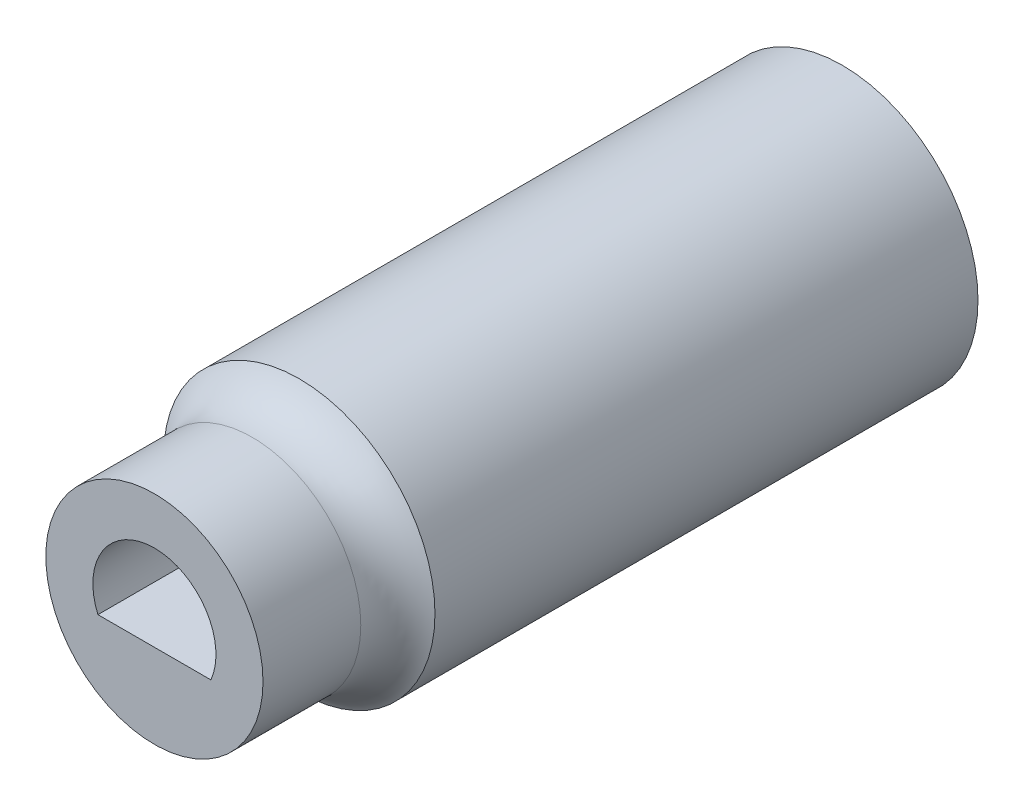
ISO-10303-21;
HEADER;
FILE_DESCRIPTION(('STEP AP214'),'2;1');
FILE_NAME('part.step','',(''),(''),'','','');
FILE_SCHEMA(('AUTOMOTIVE_DESIGN { 1 0 10303 214 1 1 1 1 }'));
ENDSEC;
DATA;
#1=APPLICATION_CONTEXT('core data for automotive mechanical design processes');
#2=APPLICATION_PROTOCOL_DEFINITION('international standard','automotive_design',2000,#1);
#3=PRODUCT_CONTEXT('',#1,'mechanical');
#4=PRODUCT('Part','Part','',(#3));
#5=PRODUCT_RELATED_PRODUCT_CATEGORY('part','',(#4));
#6=PRODUCT_DEFINITION_FORMATION('','',#4);
#7=PRODUCT_DEFINITION_CONTEXT('part definition',#1,'design');
#8=PRODUCT_DEFINITION('design','',#6,#7);
#9=PRODUCT_DEFINITION_SHAPE('','',#8);
#10=(LENGTH_UNIT() NAMED_UNIT(*) SI_UNIT(.MILLI.,.METRE.));
#11=(NAMED_UNIT(*) PLANE_ANGLE_UNIT() SI_UNIT($,.RADIAN.));
#12=(NAMED_UNIT(*) SI_UNIT($,.STERADIAN.) SOLID_ANGLE_UNIT());
#13=UNCERTAINTY_MEASURE_WITH_UNIT(LENGTH_MEASURE(1.E-05),#10,'distance_accuracy_value','');
#14=(GEOMETRIC_REPRESENTATION_CONTEXT(3) GLOBAL_UNCERTAINTY_ASSIGNED_CONTEXT((#13)) GLOBAL_UNIT_ASSIGNED_CONTEXT((#10,
#11,#12)) REPRESENTATION_CONTEXT('',''));
#15=CARTESIAN_POINT('',(0.,0.,0.));
#16=DIRECTION('',(0.,0.,1.));
#17=DIRECTION('',(1.,0.,0.));
#18=AXIS2_PLACEMENT_3D('',#15,#16,#17);
#19=CARTESIAN_POINT('',(0.,0.,38.));
#20=DIRECTION('',(0.,0.,-1.));
#21=DIRECTION('',(-1.,0.,0.));
#22=AXIS2_PLACEMENT_3D('',#19,#20,#21);
#23=CYLINDRICAL_SURFACE('',#22,7.5);
#24=CARTESIAN_POINT('',(0.,0.,0.));
#25=DIRECTION('',(0.,0.,1.));
#26=DIRECTION('',(1.,0.,0.));
#27=AXIS2_PLACEMENT_3D('',#24,#25,#26);
#28=CIRCLE('',#27,7.5);
#29=CARTESIAN_POINT('',(7.5,0.,0.));
#30=VERTEX_POINT('',#29);
#31=EDGE_CURVE('E42',#30,#30,#28,.T.);
#32=ORIENTED_EDGE('',*,*,#31,.T.);
#33=EDGE_LOOP('',(#32));
#34=FACE_BOUND('',#33,.T.);
#35=CARTESIAN_POINT('',(0.,0.,30.));
#36=DIRECTION('',(0.,0.,1.));
#37=DIRECTION('',(1.,0.,0.));
#38=AXIS2_PLACEMENT_3D('',#35,#36,#37);
#39=CIRCLE('',#38,7.5);
#40=CARTESIAN_POINT('',(7.5,0.,30.));
#41=VERTEX_POINT('',#40);
#42=EDGE_CURVE('E88',#41,#41,#39,.T.);
#43=ORIENTED_EDGE('',*,*,#42,.F.);
#44=EDGE_LOOP('',(#43));
#45=FACE_BOUND('',#44,.T.);
#46=ADVANCED_FACE('F33',(#34,#45),#23,.T.);
#47=CARTESIAN_POINT('',(0.,0.,0.));
#48=DIRECTION('',(0.,0.,1.));
#49=DIRECTION('',(1.,0.,0.));
#50=AXIS2_PLACEMENT_3D('',#47,#48,#49);
#51=PLANE('',#50);
#52=CARTESIAN_POINT('',(0.,0.,0.));
#53=DIRECTION('',(0.,0.,-1.));
#54=DIRECTION('',(-1.,0.,0.));
#55=AXIS2_PLACEMENT_3D('',#52,#53,#54);
#56=CIRCLE('',#55,4.4);
#57=CARTESIAN_POINT('',(-3.89326341261415,-2.05,0.));
#58=VERTEX_POINT('',#57);
#59=CARTESIAN_POINT('',(3.89326341261415,-2.05,0.));
#60=VERTEX_POINT('',#59);
#61=EDGE_CURVE('E92',#58,#60,#56,.T.);
#62=ORIENTED_EDGE('',*,*,#61,.F.);
#63=DIRECTION('',(-1.,0.,0.));
#64=VECTOR('',#63,1.);
#65=CARTESIAN_POINT('',(0.,-2.05,0.));
#66=LINE('',#65,#64);
#67=EDGE_CURVE('E78',#60,#58,#66,.T.);
#68=ORIENTED_EDGE('',*,*,#67,.F.);
#69=EDGE_LOOP('',(#62,#68));
#70=FACE_BOUND('',#69,.T.);
#71=ORIENTED_EDGE('',*,*,#31,.F.);
#72=EDGE_LOOP('',(#71));
#73=FACE_BOUND('',#72,.T.);
#74=ADVANCED_FACE('F96',(#70,#73),#51,.F.);
#75=CARTESIAN_POINT('',(0.,-2.05,25.));
#76=DIRECTION('',(0.,-1.,0.));
#77=DIRECTION('',(1.,0.,0.));
#78=AXIS2_PLACEMENT_3D('',#75,#76,#77);
#79=PLANE('',#78);
#80=ORIENTED_EDGE('',*,*,#67,.T.);
#81=DIRECTION('',(0.,0.,-1.));
#82=VECTOR('',#81,1.);
#83=CARTESIAN_POINT('',(-3.89326341261415,-2.05,25.));
#84=LINE('',#83,#82);
#85=CARTESIAN_POINT('',(-3.89326341261415,-2.05,25.));
#86=VERTEX_POINT('',#85);
#87=EDGE_CURVE('E81',#86,#58,#84,.T.);
#88=ORIENTED_EDGE('',*,*,#87,.F.);
#89=DIRECTION('',(-1.,0.,0.));
#90=VECTOR('',#89,1.);
#91=CARTESIAN_POINT('',(0.,-2.05,25.));
#92=LINE('',#91,#90);
#93=CARTESIAN_POINT('',(3.89326341261415,-2.05,25.));
#94=VERTEX_POINT('',#93);
#95=EDGE_CURVE('E68',#94,#86,#92,.T.);
#96=ORIENTED_EDGE('',*,*,#95,.F.);
#97=DIRECTION('',(0.,0.,-1.));
#98=VECTOR('',#97,1.);
#99=CARTESIAN_POINT('',(3.89326341261415,-2.05,25.));
#100=LINE('',#99,#98);
#101=EDGE_CURVE('E84',#94,#60,#100,.T.);
#102=ORIENTED_EDGE('',*,*,#101,.T.);
#103=EDGE_LOOP('',(#80,#88,#96,#102));
#104=FACE_BOUND('',#103,.T.);
#105=ADVANCED_FACE('F80',(#104),#79,.F.);
#106=CARTESIAN_POINT('',(0.,0.,25.));
#107=DIRECTION('',(0.,0.,-1.));
#108=DIRECTION('',(-1.,0.,0.));
#109=AXIS2_PLACEMENT_3D('',#106,#107,#108);
#110=PLANE('',#109);
#111=ORIENTED_EDGE('',*,*,#95,.T.);
#112=CARTESIAN_POINT('',(0.,0.,25.));
#113=DIRECTION('',(0.,0.,-1.));
#114=DIRECTION('',(-1.,0.,0.));
#115=AXIS2_PLACEMENT_3D('',#112,#113,#114);
#116=CIRCLE('',#115,4.4);
#117=EDGE_CURVE('E93',#86,#94,#116,.T.);
#118=ORIENTED_EDGE('',*,*,#117,.T.);
#119=EDGE_LOOP('',(#111,#118));
#120=FACE_BOUND('',#119,.T.);
#121=ADVANCED_FACE('F130',(#120),#110,.T.);
#122=CARTESIAN_POINT('',(0.,0.,30.));
#123=DIRECTION('',(0.,0.,1.));
#124=DIRECTION('',(1.,0.,0.));
#125=AXIS2_PLACEMENT_3D('',#122,#123,#124);
#126=CYLINDRICAL_SURFACE('',#125,6.);
#127=CARTESIAN_POINT('',(0.,0.,32.5980762113533));
#128=DIRECTION('',(0.,0.,-1.));
#129=DIRECTION('',(-1.,0.,0.));
#130=AXIS2_PLACEMENT_3D('',#127,#128,#129);
#131=CIRCLE('',#130,6.);
#132=CARTESIAN_POINT('',(-6.,0.,32.5980762113533));
#133=VERTEX_POINT('',#132);
#134=EDGE_CURVE('E11',#133,#133,#131,.F.);
#135=ORIENTED_EDGE('',*,*,#134,.T.);
#136=EDGE_LOOP('',(#135));
#137=FACE_BOUND('',#136,.T.);
#138=CARTESIAN_POINT('',(0.,0.,38.));
#139=DIRECTION('',(0.,0.,1.));
#140=DIRECTION('',(1.,0.,0.));
#141=AXIS2_PLACEMENT_3D('',#138,#139,#140);
#142=CIRCLE('',#141,6.);
#143=CARTESIAN_POINT('',(6.,0.,38.));
#144=VERTEX_POINT('',#143);
#145=EDGE_CURVE('E112',#144,#144,#142,.T.);
#146=ORIENTED_EDGE('',*,*,#145,.F.);
#147=EDGE_LOOP('',(#146));
#148=FACE_BOUND('',#147,.T.);
#149=ADVANCED_FACE('F139',(#137,#148),#126,.T.);
#150=CARTESIAN_POINT('',(0.,-1.35,28.5));
#151=DIRECTION('',(0.,-1.,0.));
#152=DIRECTION('',(0.,0.,-1.));
#153=AXIS2_PLACEMENT_3D('',#150,#151,#152);
#154=PLANE('',#153);
#155=DIRECTION('',(1.,0.,0.));
#156=VECTOR('',#155,1.);
#157=CARTESIAN_POINT('',(0.,-1.35,38.));
#158=LINE('',#157,#156);
#159=CARTESIAN_POINT('',(-3.12049675532599,-1.35,38.));
#160=VERTEX_POINT('',#159);
#161=CARTESIAN_POINT('',(3.12049675532599,-1.35,38.));
#162=VERTEX_POINT('',#161);
#163=EDGE_CURVE('E60',#160,#162,#158,.T.);
#164=ORIENTED_EDGE('',*,*,#163,.T.);
#165=DIRECTION('',(0.,0.,1.));
#166=VECTOR('',#165,1.);
#167=CARTESIAN_POINT('',(3.12049675532599,-1.35,28.));
#168=LINE('',#167,#166);
#169=CARTESIAN_POINT('',(3.12049675532599,-1.35,28.));
#170=VERTEX_POINT('',#169);
#171=EDGE_CURVE('E50',#170,#162,#168,.T.);
#172=ORIENTED_EDGE('',*,*,#171,.F.);
#173=DIRECTION('',(1.,0.,0.));
#174=VECTOR('',#173,1.);
#175=CARTESIAN_POINT('',(-3.12049675532599,-1.35,28.));
#176=LINE('',#175,#174);
#177=CARTESIAN_POINT('',(-3.12049675532599,-1.35,28.));
#178=VERTEX_POINT('',#177);
#179=EDGE_CURVE('E105',#178,#170,#176,.T.);
#180=ORIENTED_EDGE('',*,*,#179,.F.);
#181=DIRECTION('',(0.,0.,1.));
#182=VECTOR('',#181,1.);
#183=CARTESIAN_POINT('',(-3.12049675532599,-1.35,28.));
#184=LINE('',#183,#182);
#185=EDGE_CURVE('E108',#178,#160,#184,.T.);
#186=ORIENTED_EDGE('',*,*,#185,.T.);
#187=EDGE_LOOP('',(#164,#172,#180,#186));
#188=FACE_BOUND('',#187,.T.);
#189=ADVANCED_FACE('F137',(#188),#154,.F.);
#190=CARTESIAN_POINT('',(0.,0.,38.));
#191=DIRECTION('',(0.,0.,1.));
#192=DIRECTION('',(1.,0.,0.));
#193=AXIS2_PLACEMENT_3D('',#190,#191,#192);
#194=PLANE('',#193);
#195=ORIENTED_EDGE('',*,*,#163,.F.);
#196=CARTESIAN_POINT('',(0.,0.,38.));
#197=DIRECTION('',(0.,0.,1.));
#198=DIRECTION('',(1.,0.,0.));
#199=AXIS2_PLACEMENT_3D('',#196,#197,#198);
#200=CIRCLE('',#199,3.4);
#201=EDGE_CURVE('E94',#162,#160,#200,.T.);
#202=ORIENTED_EDGE('',*,*,#201,.F.);
#203=EDGE_LOOP('',(#195,#202));
#204=FACE_BOUND('',#203,.T.);
#205=ORIENTED_EDGE('',*,*,#145,.T.);
#206=EDGE_LOOP('',(#205));
#207=FACE_BOUND('',#206,.T.);
#208=ADVANCED_FACE('F134',(#204,#207),#194,.T.);
#209=CARTESIAN_POINT('',(0.,0.,32.5980762113533));
#210=DIRECTION('',(0.,0.,-1.));
#211=DIRECTION('',(-1.,0.,0.));
#212=AXIS2_PLACEMENT_3D('',#209,#210,#211);
#213=TOROIDAL_SURFACE('',#212,9.,3.);
#214=ORIENTED_EDGE('',*,*,#42,.T.);
#215=EDGE_LOOP('',(#214));
#216=FACE_BOUND('',#215,.T.);
#217=ORIENTED_EDGE('',*,*,#134,.F.);
#218=EDGE_LOOP('',(#217));
#219=FACE_BOUND('',#218,.T.);
#220=ADVANCED_FACE('F35',(#216,#219),#213,.F.);
#221=CARTESIAN_POINT('',(0.,0.,28.));
#222=DIRECTION('',(0.,0.,1.));
#223=DIRECTION('',(1.,0.,0.));
#224=AXIS2_PLACEMENT_3D('',#221,#222,#223);
#225=CYLINDRICAL_SURFACE('',#224,3.4);
#226=ORIENTED_EDGE('',*,*,#201,.T.);
#227=ORIENTED_EDGE('',*,*,#185,.F.);
#228=CARTESIAN_POINT('',(0.,0.,28.));
#229=DIRECTION('',(0.,0.,1.));
#230=DIRECTION('',(1.,0.,0.));
#231=AXIS2_PLACEMENT_3D('',#228,#229,#230);
#232=CIRCLE('',#231,3.4);
#233=EDGE_CURVE('E102',#170,#178,#232,.T.);
#234=ORIENTED_EDGE('',*,*,#233,.F.);
#235=ORIENTED_EDGE('',*,*,#171,.T.);
#236=EDGE_LOOP('',(#226,#227,#234,#235));
#237=FACE_BOUND('',#236,.T.);
#238=ADVANCED_FACE('F146',(#237),#225,.F.);
#239=CARTESIAN_POINT('',(0.,0.,28.));
#240=DIRECTION('',(0.,0.,1.));
#241=DIRECTION('',(1.,0.,0.));
#242=AXIS2_PLACEMENT_3D('',#239,#240,#241);
#243=PLANE('',#242);
#244=ORIENTED_EDGE('',*,*,#233,.T.);
#245=ORIENTED_EDGE('',*,*,#179,.T.);
#246=EDGE_LOOP('',(#244,#245));
#247=FACE_BOUND('',#246,.T.);
#248=ADVANCED_FACE('F149',(#247),#243,.T.);
#249=CARTESIAN_POINT('',(0.,0.,25.));
#250=DIRECTION('',(0.,0.,-1.));
#251=DIRECTION('',(-1.,0.,0.));
#252=AXIS2_PLACEMENT_3D('',#249,#250,#251);
#253=CYLINDRICAL_SURFACE('',#252,4.4);
#254=ORIENTED_EDGE('',*,*,#61,.T.);
#255=ORIENTED_EDGE('',*,*,#101,.F.);
#256=ORIENTED_EDGE('',*,*,#117,.F.);
#257=ORIENTED_EDGE('',*,*,#87,.T.);
#258=EDGE_LOOP('',(#254,#255,#256,#257));
#259=FACE_BOUND('',#258,.T.);
#260=ADVANCED_FACE('F91',(#259),#253,.F.);
#261=CLOSED_SHELL('',(#46,#74,#105,#121,#149,#189,#208,#220,#238,#248,#260));
#262=MANIFOLD_SOLID_BREP('B2',#261);
#263=ADVANCED_BREP_SHAPE_REPRESENTATION('',(#18,#262),#14);
#264=SHAPE_DEFINITION_REPRESENTATION(#9,#263);
ENDSEC;
END-ISO-10303-21;
